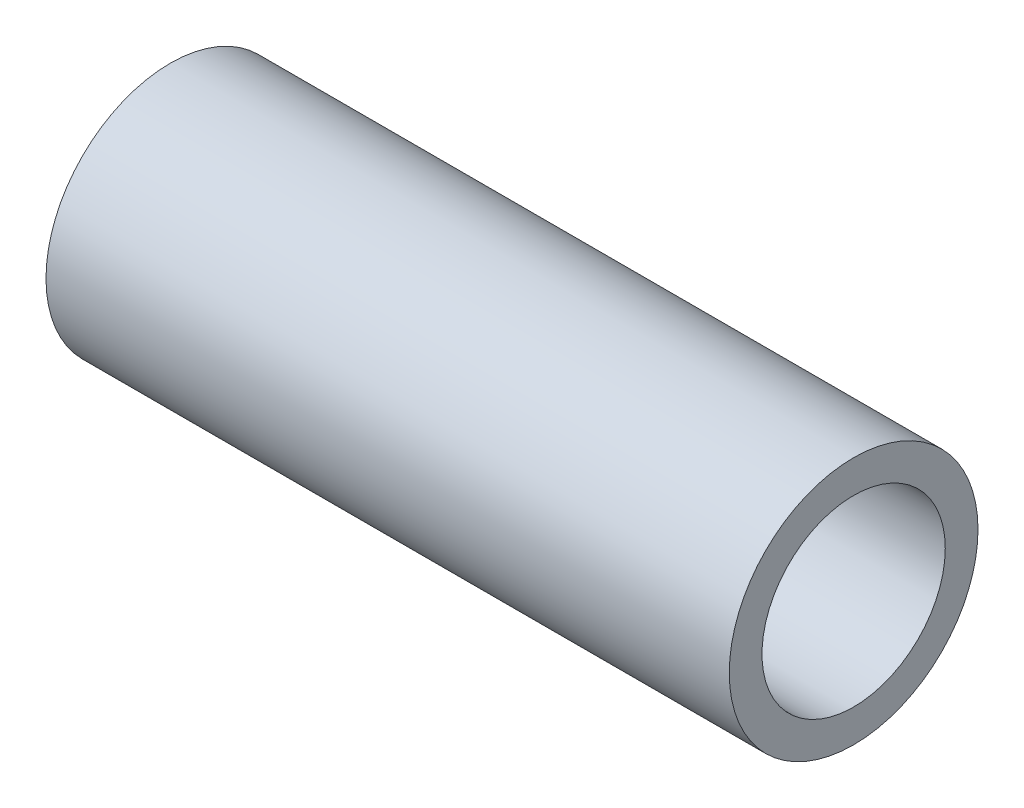
ISO-10303-21;
HEADER;
FILE_DESCRIPTION(('STEP AP214'),'2;1');
FILE_NAME('part.step','',(''),(''),'','','');
FILE_SCHEMA(('AUTOMOTIVE_DESIGN { 1 0 10303 214 1 1 1 1 }'));
ENDSEC;
DATA;
#1=APPLICATION_CONTEXT('core data for automotive mechanical design processes');
#2=APPLICATION_PROTOCOL_DEFINITION('international standard','automotive_design',2000,#1);
#3=PRODUCT_CONTEXT('',#1,'mechanical');
#4=PRODUCT('Part','Part','',(#3));
#5=PRODUCT_RELATED_PRODUCT_CATEGORY('part','',(#4));
#6=PRODUCT_DEFINITION_FORMATION('','',#4);
#7=PRODUCT_DEFINITION_CONTEXT('part definition',#1,'design');
#8=PRODUCT_DEFINITION('design','',#6,#7);
#9=PRODUCT_DEFINITION_SHAPE('','',#8);
#10=(LENGTH_UNIT() NAMED_UNIT(*) SI_UNIT(.MILLI.,.METRE.));
#11=(NAMED_UNIT(*) PLANE_ANGLE_UNIT() SI_UNIT($,.RADIAN.));
#12=(NAMED_UNIT(*) SI_UNIT($,.STERADIAN.) SOLID_ANGLE_UNIT());
#13=UNCERTAINTY_MEASURE_WITH_UNIT(LENGTH_MEASURE(1.E-05),#10,'distance_accuracy_value','');
#14=(GEOMETRIC_REPRESENTATION_CONTEXT(3) GLOBAL_UNCERTAINTY_ASSIGNED_CONTEXT((#13)) GLOBAL_UNIT_ASSIGNED_CONTEXT((#10,
#11,#12)) REPRESENTATION_CONTEXT('',''));
#15=CARTESIAN_POINT('',(0.,0.,0.));
#16=DIRECTION('',(0.,0.,1.));
#17=DIRECTION('',(1.,0.,0.));
#18=AXIS2_PLACEMENT_3D('',#15,#16,#17);
#19=CARTESIAN_POINT('',(53.02758,0.,0.));
#20=DIRECTION('',(1.,0.,0.));
#21=DIRECTION('',(0.,0.,-1.));
#22=AXIS2_PLACEMENT_3D('',#19,#20,#21);
#23=PLANE('',#22);
#24=CARTESIAN_POINT('',(53.02758,0.,0.));
#25=DIRECTION('',(1.,0.,0.));
#26=DIRECTION('',(0.,0.,-1.));
#27=AXIS2_PLACEMENT_3D('',#24,#25,#26);
#28=CIRCLE('',#27,9.652);
#29=CARTESIAN_POINT('',(53.02758,0.,-9.652));
#30=VERTEX_POINT('',#29);
#31=EDGE_CURVE('E10',#30,#30,#28,.T.);
#32=ORIENTED_EDGE('',*,*,#31,.T.);
#33=EDGE_LOOP('',(#32));
#34=FACE_BOUND('',#33,.T.);
#35=CARTESIAN_POINT('',(53.02758,0.,0.));
#36=DIRECTION('',(1.,0.,0.));
#37=DIRECTION('',(0.,0.,-1.));
#38=AXIS2_PLACEMENT_3D('',#35,#36,#37);
#39=CIRCLE('',#38,7.112);
#40=CARTESIAN_POINT('',(53.02758,0.,-7.112));
#41=VERTEX_POINT('',#40);
#42=EDGE_CURVE('E50',#41,#41,#39,.T.);
#43=ORIENTED_EDGE('',*,*,#42,.F.);
#44=EDGE_LOOP('',(#43));
#45=FACE_BOUND('',#44,.T.);
#46=ADVANCED_FACE('F37',(#34,#45),#23,.T.);
#47=CARTESIAN_POINT('',(0.,0.,0.));
#48=DIRECTION('',(1.,0.,0.));
#49=DIRECTION('',(0.,0.,-1.));
#50=AXIS2_PLACEMENT_3D('',#47,#48,#49);
#51=PLANE('',#50);
#52=CARTESIAN_POINT('',(0.,0.,0.));
#53=DIRECTION('',(1.,0.,0.));
#54=DIRECTION('',(0.,0.,-1.));
#55=AXIS2_PLACEMENT_3D('',#52,#53,#54);
#56=CIRCLE('',#55,9.652);
#57=CARTESIAN_POINT('',(0.,0.,-9.652));
#58=VERTEX_POINT('',#57);
#59=EDGE_CURVE('E41',#58,#58,#56,.T.);
#60=ORIENTED_EDGE('',*,*,#59,.F.);
#61=EDGE_LOOP('',(#60));
#62=FACE_BOUND('',#61,.T.);
#63=CARTESIAN_POINT('',(0.,0.,0.));
#64=DIRECTION('',(1.,0.,0.));
#65=DIRECTION('',(0.,0.,-1.));
#66=AXIS2_PLACEMENT_3D('',#63,#64,#65);
#67=CIRCLE('',#66,7.112);
#68=CARTESIAN_POINT('',(0.,0.,-7.112));
#69=VERTEX_POINT('',#68);
#70=EDGE_CURVE('E52',#69,#69,#67,.T.);
#71=ORIENTED_EDGE('',*,*,#70,.T.);
#72=EDGE_LOOP('',(#71));
#73=FACE_BOUND('',#72,.T.);
#74=ADVANCED_FACE('F64',(#62,#73),#51,.F.);
#75=CARTESIAN_POINT('',(53.02758,0.,0.));
#76=DIRECTION('',(-1.,0.,0.));
#77=DIRECTION('',(0.,0.,1.));
#78=AXIS2_PLACEMENT_3D('',#75,#76,#77);
#79=CYLINDRICAL_SURFACE('',#78,9.652);
#80=ORIENTED_EDGE('',*,*,#31,.F.);
#81=EDGE_LOOP('',(#80));
#82=FACE_BOUND('',#81,.T.);
#83=ORIENTED_EDGE('',*,*,#59,.T.);
#84=EDGE_LOOP('',(#83));
#85=FACE_BOUND('',#84,.T.);
#86=ADVANCED_FACE('F39',(#82,#85),#79,.T.);
#87=CARTESIAN_POINT('',(53.02758,0.,0.));
#88=DIRECTION('',(-1.,0.,0.));
#89=DIRECTION('',(0.,0.,1.));
#90=AXIS2_PLACEMENT_3D('',#87,#88,#89);
#91=CYLINDRICAL_SURFACE('',#90,7.112);
#92=ORIENTED_EDGE('',*,*,#42,.T.);
#93=EDGE_LOOP('',(#92));
#94=FACE_BOUND('',#93,.T.);
#95=ORIENTED_EDGE('',*,*,#70,.F.);
#96=EDGE_LOOP('',(#95));
#97=FACE_BOUND('',#96,.T.);
#98=ADVANCED_FACE('F60',(#94,#97),#91,.F.);
#99=CLOSED_SHELL('',(#46,#74,#86,#98));
#100=MANIFOLD_SOLID_BREP('B2',#99);
#101=ADVANCED_BREP_SHAPE_REPRESENTATION('',(#18,#100),#14);
#102=SHAPE_DEFINITION_REPRESENTATION(#9,#101);
ENDSEC;
END-ISO-10303-21;
